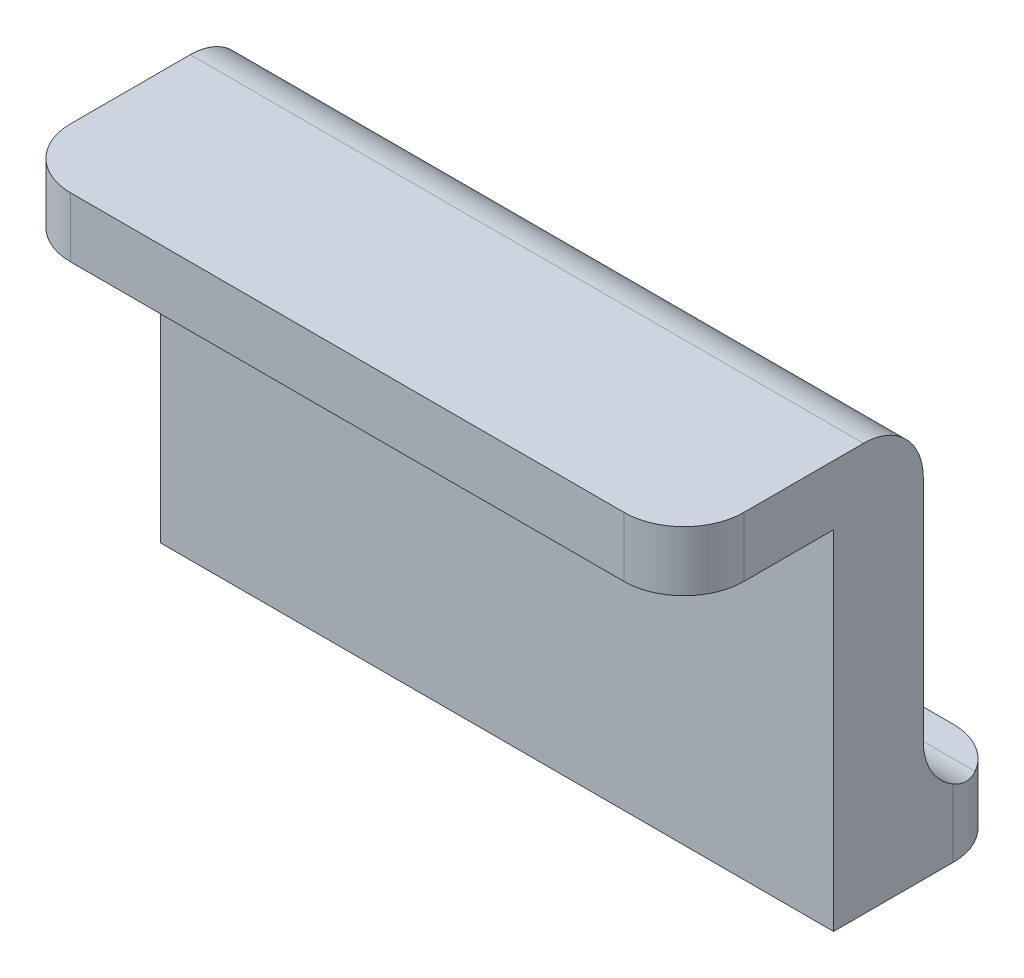
ISO-10303-21;
HEADER;
FILE_DESCRIPTION(('STEP AP214'),'2;1');
FILE_NAME('part.step','',(''),(''),'','','');
FILE_SCHEMA(('AUTOMOTIVE_DESIGN { 1 0 10303 214 1 1 1 1 }'));
ENDSEC;
DATA;
#1=APPLICATION_CONTEXT('core data for automotive mechanical design processes');
#2=APPLICATION_PROTOCOL_DEFINITION('international standard','automotive_design',2000,#1);
#3=PRODUCT_CONTEXT('',#1,'mechanical');
#4=PRODUCT('Part','Part','',(#3));
#5=PRODUCT_RELATED_PRODUCT_CATEGORY('part','',(#4));
#6=PRODUCT_DEFINITION_FORMATION('','',#4);
#7=PRODUCT_DEFINITION_CONTEXT('part definition',#1,'design');
#8=PRODUCT_DEFINITION('design','',#6,#7);
#9=PRODUCT_DEFINITION_SHAPE('','',#8);
#10=(LENGTH_UNIT() NAMED_UNIT(*) SI_UNIT(.MILLI.,.METRE.));
#11=(NAMED_UNIT(*) PLANE_ANGLE_UNIT() SI_UNIT($,.RADIAN.));
#12=(NAMED_UNIT(*) SI_UNIT($,.STERADIAN.) SOLID_ANGLE_UNIT());
#13=UNCERTAINTY_MEASURE_WITH_UNIT(LENGTH_MEASURE(1.E-05),#10,'distance_accuracy_value','');
#14=(GEOMETRIC_REPRESENTATION_CONTEXT(3) GLOBAL_UNCERTAINTY_ASSIGNED_CONTEXT((#13)) GLOBAL_UNIT_ASSIGNED_CONTEXT((#10,
#11,#12)) REPRESENTATION_CONTEXT('',''));
#15=CARTESIAN_POINT('',(0.,0.,0.));
#16=DIRECTION('',(0.,0.,1.));
#17=DIRECTION('',(1.,0.,0.));
#18=AXIS2_PLACEMENT_3D('',#15,#16,#17);
#19=CARTESIAN_POINT('',(20.5000000000001,-9.62999999999984,-5.00000000000003));
#20=DIRECTION('',(0.,-1.,0.));
#21=DIRECTION('',(1.,0.,0.));
#22=AXIS2_PLACEMENT_3D('',#19,#20,#21);
#23=PLANE('',#22);
#24=CARTESIAN_POINT('',(1.99999999999999,-9.62999999999997,-9.00000000000001));
#25=DIRECTION('',(0.,-1.,0.));
#26=DIRECTION('',(1.,0.,0.));
#27=AXIS2_PLACEMENT_3D('',#24,#25,#26);
#28=CIRCLE('',#27,2.);
#29=CARTESIAN_POINT('',(0.267949192431116,-9.62999999999998,-10.));
#30=VERTEX_POINT('',#29);
#31=CARTESIAN_POINT('',(1.99999999999999,-9.62999999999996,-11.));
#32=VERTEX_POINT('',#31);
#33=EDGE_CURVE('E171',#30,#32,#28,.T.);
#34=ORIENTED_EDGE('',*,*,#33,.F.);
#35=DIRECTION('',(-1.,0.,0.));
#36=VECTOR('',#35,1.);
#37=CARTESIAN_POINT('',(22.5,-9.62999999999982,-10.));
#38=LINE('',#37,#36);
#39=CARTESIAN_POINT('',(22.2320508075689,-9.62999999999982,-10.));
#40=VERTEX_POINT('',#39);
#41=EDGE_CURVE('E228',#30,#40,#38,.F.);
#42=ORIENTED_EDGE('',*,*,#41,.T.);
#43=CARTESIAN_POINT('',(20.5,-9.62999999999984,-9.00000000000001));
#44=DIRECTION('',(0.,-1.,0.));
#45=DIRECTION('',(1.,0.,0.));
#46=AXIS2_PLACEMENT_3D('',#43,#44,#45);
#47=CIRCLE('',#46,2.);
#48=CARTESIAN_POINT('',(20.5,-9.62999999999983,-11.));
#49=VERTEX_POINT('',#48);
#50=EDGE_CURVE('E177',#49,#40,#47,.T.);
#51=ORIENTED_EDGE('',*,*,#50,.F.);
#52=DIRECTION('',(1.,0.,0.));
#53=VECTOR('',#52,1.);
#54=CARTESIAN_POINT('',(1.99999999999999,-9.62999999999996,-11.));
#55=LINE('',#54,#53);
#56=EDGE_CURVE('E173',#32,#49,#55,.T.);
#57=ORIENTED_EDGE('',*,*,#56,.F.);
#58=EDGE_LOOP('',(#34,#42,#51,#57));
#59=FACE_BOUND('',#58,.T.);
#60=ADVANCED_FACE('F33',(#59),#23,.F.);
#61=CARTESIAN_POINT('',(2.,-11.63,-5.));
#62=DIRECTION('',(0.,1.,0.));
#63=DIRECTION('',(0.,0.,1.));
#64=AXIS2_PLACEMENT_3D('',#61,#62,#63);
#65=PLANE('',#64);
#66=DIRECTION('',(-1.,0.,0.));
#67=VECTOR('',#66,1.);
#68=CARTESIAN_POINT('',(22.5000000000003,-11.63,-5.00000000000003));
#69=LINE('',#68,#67);
#70=CARTESIAN_POINT('',(22.5000000000003,-11.63,-5.00000000000003));
#71=VERTEX_POINT('',#70);
#72=CARTESIAN_POINT('',(0.,-11.63,-5.00000000000003));
#73=VERTEX_POINT('',#72);
#74=EDGE_CURVE('E148',#71,#73,#69,.T.);
#75=ORIENTED_EDGE('',*,*,#74,.T.);
#76=DIRECTION('',(0.,0.,1.));
#77=VECTOR('',#76,1.);
#78=CARTESIAN_POINT('',(0.,-11.63,-5.));
#79=LINE('',#78,#77);
#80=CARTESIAN_POINT('',(0.,-11.63,-9.00000000000002));
#81=VERTEX_POINT('',#80);
#82=EDGE_CURVE('E133',#81,#73,#79,.T.);
#83=ORIENTED_EDGE('',*,*,#82,.F.);
#84=CARTESIAN_POINT('',(2.,-11.63,-9.00000000000002));
#85=DIRECTION('',(0.,-1.,0.));
#86=DIRECTION('',(1.,0.,0.));
#87=AXIS2_PLACEMENT_3D('',#84,#85,#86);
#88=CIRCLE('',#87,2.);
#89=CARTESIAN_POINT('',(2.,-11.63,-11.));
#90=VERTEX_POINT('',#89);
#91=EDGE_CURVE('E170',#81,#90,#88,.T.);
#92=ORIENTED_EDGE('',*,*,#91,.T.);
#93=DIRECTION('',(1.,0.,0.));
#94=VECTOR('',#93,1.);
#95=CARTESIAN_POINT('',(2.,-11.63,-11.));
#96=LINE('',#95,#94);
#97=CARTESIAN_POINT('',(20.5000000000001,-11.6299999999998,-11.));
#98=VERTEX_POINT('',#97);
#99=EDGE_CURVE('E181',#90,#98,#96,.T.);
#100=ORIENTED_EDGE('',*,*,#99,.T.);
#101=CARTESIAN_POINT('',(20.5000000000001,-11.6299999999998,-9.00000000000002));
#102=DIRECTION('',(0.,-1.,0.));
#103=DIRECTION('',(1.,0.,0.));
#104=AXIS2_PLACEMENT_3D('',#101,#102,#103);
#105=CIRCLE('',#104,2.);
#106=CARTESIAN_POINT('',(22.5000000000001,-11.6299999999998,-9.00000000000002));
#107=VERTEX_POINT('',#106);
#108=EDGE_CURVE('E174',#98,#107,#105,.T.);
#109=ORIENTED_EDGE('',*,*,#108,.T.);
#110=DIRECTION('',(0.,0.,-1.));
#111=VECTOR('',#110,1.);
#112=CARTESIAN_POINT('',(22.5,-11.63,-5.));
#113=LINE('',#112,#111);
#114=EDGE_CURVE('E143',#71,#107,#113,.T.);
#115=ORIENTED_EDGE('',*,*,#114,.F.);
#116=EDGE_LOOP('',(#75,#83,#92,#100,#109,#115));
#117=FACE_BOUND('',#116,.T.);
#118=ADVANCED_FACE('F154',(#117),#65,.F.);
#119=CARTESIAN_POINT('',(20.5,-9.62999999999984,-9.00000000000001));
#120=DIRECTION('',(0.,-1.,0.));
#121=DIRECTION('',(1.,0.,0.));
#122=AXIS2_PLACEMENT_3D('',#119,#120,#121);
#123=CYLINDRICAL_SURFACE('',#122,2.);
#124=ORIENTED_EDGE('',*,*,#108,.F.);
#125=DIRECTION('',(0.,-1.,0.));
#126=VECTOR('',#125,1.);
#127=CARTESIAN_POINT('',(20.5,-9.62999999999983,-11.));
#128=LINE('',#127,#126);
#129=EDGE_CURVE('E186',#49,#98,#128,.T.);
#130=ORIENTED_EDGE('',*,*,#129,.F.);
#131=ORIENTED_EDGE('',*,*,#50,.T.);
#132=CARTESIAN_POINT('',(22.2320508075689,-9.62999999999982,-10.));
#133=CARTESIAN_POINT('',(22.2532543585525,-9.63000582336066,-9.96328949807708));
#134=CARTESIAN_POINT('',(22.2732816954026,-9.62898920413644,-9.92589035620287));
#135=CARTESIAN_POINT('',(22.310886635328,-9.62472694242895,-9.84998615163987));
#136=CARTESIAN_POINT('',(22.3284632545006,-9.62148040777174,-9.81148065221543));
#137=CARTESIAN_POINT('',(22.3610482817277,-9.61257497903467,-9.73367455806133));
#138=CARTESIAN_POINT('',(22.376057323387,-9.60691668131581,-9.69437416217401));
#139=CARTESIAN_POINT('',(22.4034509332815,-9.59306905722044,-9.6153270771921));
#140=CARTESIAN_POINT('',(22.4158360642531,-9.58488027447186,-9.57558048572007));
#141=CARTESIAN_POINT('',(22.4490813852997,-9.55632820920577,-9.45597583000072));
#142=CARTESIAN_POINT('',(22.4659723496888,-9.53199453282509,-9.37589597407771));
#143=CARTESIAN_POINT('',(22.4896359876529,-9.4728601982396,-9.21837892489139));
#144=CARTESIAN_POINT('',(22.496432780998,-9.43808473047974,-9.14093586553849));
#145=CARTESIAN_POINT('',(22.4992772698719,-9.3926609376351,-9.05491456474152));
#146=CARTESIAN_POINT('',(22.499549809393,-9.38668163750179,-9.04384685892208));
#147=CARTESIAN_POINT('',(22.4999109060144,-9.37451956100022,-9.02183409565792));
#148=CARTESIAN_POINT('',(22.4999996327205,-9.36833697756048,-9.01088893442525));
#149=CARTESIAN_POINT('',(22.5,-9.36205080756869,-9.00000000000001));
#150=B_SPLINE_CURVE_WITH_KNOTS('',3,(#132,#133,#134,#135,#136,#137,#138,#139,#140,#141,#142,
#143,#144,#145,#146,#147,#148,#149),.UNSPECIFIED.,.F.,.F.,(4,2,2,2,2,2,2,2,4),(0.,
0.127159561382101,0.25437002809369,0.381549057475173,0.508700783765295,0.763464547972432,
1.01761857554666,1.05536583812813,1.09307825540804),.UNSPECIFIED.);
#151=CARTESIAN_POINT('',(22.5,-9.36205080756869,-9.00000000000001));
#152=VERTEX_POINT('',#151);
#153=EDGE_CURVE('E41',#40,#152,#150,.T.);
#154=ORIENTED_EDGE('',*,*,#153,.T.);
#155=DIRECTION('',(0.,-1.,0.));
#156=VECTOR('',#155,1.);
#157=CARTESIAN_POINT('',(22.5,-9.62999999999982,-9.00000000000001));
#158=LINE('',#157,#156);
#159=EDGE_CURVE('E47',#152,#107,#158,.T.);
#160=ORIENTED_EDGE('',*,*,#159,.T.);
#161=EDGE_LOOP('',(#124,#130,#131,#154,#160));
#162=FACE_BOUND('',#161,.T.);
#163=ADVANCED_FACE('F261',(#162),#123,.T.);
#164=CARTESIAN_POINT('',(1.99999999999999,-9.62999999999996,-11.));
#165=DIRECTION('',(0.,0.,-1.));
#166=DIRECTION('',(0.,1.,0.));
#167=AXIS2_PLACEMENT_3D('',#164,#165,#166);
#168=PLANE('',#167);
#169=ORIENTED_EDGE('',*,*,#99,.F.);
#170=DIRECTION('',(0.,-1.,0.));
#171=VECTOR('',#170,1.);
#172=CARTESIAN_POINT('',(1.99999999999999,-9.62999999999996,-11.));
#173=LINE('',#172,#171);
#174=EDGE_CURVE('E188',#32,#90,#173,.T.);
#175=ORIENTED_EDGE('',*,*,#174,.F.);
#176=ORIENTED_EDGE('',*,*,#56,.T.);
#177=ORIENTED_EDGE('',*,*,#129,.T.);
#178=EDGE_LOOP('',(#169,#175,#176,#177));
#179=FACE_BOUND('',#178,.T.);
#180=ADVANCED_FACE('F258',(#179),#168,.T.);
#181=CARTESIAN_POINT('',(1.99999999999999,-9.62999999999997,-9.00000000000001));
#182=DIRECTION('',(0.,-1.,0.));
#183=DIRECTION('',(1.,0.,0.));
#184=AXIS2_PLACEMENT_3D('',#181,#182,#183);
#185=CYLINDRICAL_SURFACE('',#184,2.);
#186=ORIENTED_EDGE('',*,*,#91,.F.);
#187=DIRECTION('',(0.,-1.,0.));
#188=VECTOR('',#187,1.);
#189=CARTESIAN_POINT('',(0.,-9.62999999999998,-9.00000000000001));
#190=LINE('',#189,#188);
#191=CARTESIAN_POINT('',(0.,-9.36205080756885,-9.00000000000001));
#192=VERTEX_POINT('',#191);
#193=EDGE_CURVE('E55',#192,#81,#190,.T.);
#194=ORIENTED_EDGE('',*,*,#193,.F.);
#195=CARTESIAN_POINT('',(0.,-9.36205080756885,-9.00000000000001));
#196=CARTESIAN_POINT('',(-5.82336084557029E-06,-9.38325435855244,-9.03671050192296));
#197=CARTESIAN_POINT('',(0.00101079586336832,-9.40328169540257,-9.07410964379718));
#198=CARTESIAN_POINT('',(0.00527305757086106,-9.44088663532798,-9.15001384836017));
#199=CARTESIAN_POINT('',(0.00851959222807289,-9.45846325450054,-9.18851934778461));
#200=CARTESIAN_POINT('',(0.0174250209651449,-9.49104828172769,-9.26632544193871));
#201=CARTESIAN_POINT('',(0.0230833186839982,-9.50605732338695,-9.30562583782603));
#202=CARTESIAN_POINT('',(0.0369309427793674,-9.53345093328145,-9.38467292280795));
#203=CARTESIAN_POINT('',(0.0451197255279513,-9.54583606425304,-9.42441951427997));
#204=CARTESIAN_POINT('',(0.0736717907940388,-9.5790813852996,-9.54402416999932));
#205=CARTESIAN_POINT('',(0.098005467174716,-9.59597234968877,-9.62410402592234));
#206=CARTESIAN_POINT('',(0.15713980176021,-9.61963598765283,-9.78162107510865));
#207=CARTESIAN_POINT('',(0.19191526952007,-9.62643278099795,-9.85906413446155));
#208=CARTESIAN_POINT('',(0.237339062364713,-9.6292772698718,-9.94508543525852));
#209=CARTESIAN_POINT('',(0.243318362498015,-9.62954980939291,-9.95615314107796));
#210=CARTESIAN_POINT('',(0.255480438999585,-9.62991090601429,-9.97816590434212));
#211=CARTESIAN_POINT('',(0.261663022439332,-9.62999963272039,-9.98911106557479));
#212=CARTESIAN_POINT('',(0.267949192431115,-9.62999999999998,-10.));
#213=B_SPLINE_CURVE_WITH_KNOTS('',3,(#195,#196,#197,#198,#199,#200,#201,#202,#203,#204,#205,
#206,#207,#208,#209,#210,#211,#212),.UNSPECIFIED.,.F.,.F.,(4,2,2,2,2,2,2,2,4),(0.,
0.127159561382106,0.254370028093691,0.381549057475175,0.508700783765294,0.76346454797243,
1.01761857554666,1.05536583812813,1.09307825540803),.UNSPECIFIED.);
#214=EDGE_CURVE('E238',#192,#30,#213,.T.);
#215=ORIENTED_EDGE('',*,*,#214,.T.);
#216=ORIENTED_EDGE('',*,*,#33,.T.);
#217=ORIENTED_EDGE('',*,*,#174,.T.);
#218=EDGE_LOOP('',(#186,#194,#215,#216,#217));
#219=FACE_BOUND('',#218,.T.);
#220=ADVANCED_FACE('F252',(#219),#185,.T.);
#221=CARTESIAN_POINT('',(22.4999999999998,24.6991189256325,-7.99999999999995));
#222=DIRECTION('',(0.,0.,1.));
#223=DIRECTION('',(0.,-1.,0.));
#224=AXIS2_PLACEMENT_3D('',#221,#222,#223);
#225=PLANE('',#224);
#226=DIRECTION('',(0.,-1.,0.));
#227=VECTOR('',#226,1.);
#228=CARTESIAN_POINT('',(22.4999999999998,24.6991189256325,-7.99999999999995));
#229=LINE('',#228,#227);
#230=CARTESIAN_POINT('',(22.5,0.,-8.00000000000001));
#231=VERTEX_POINT('',#230);
#232=CARTESIAN_POINT('',(22.5000000000001,-7.62999999999982,-8.00000000000002));
#233=VERTEX_POINT('',#232);
#234=EDGE_CURVE('E162',#231,#233,#229,.T.);
#235=ORIENTED_EDGE('',*,*,#234,.T.);
#236=DIRECTION('',(-1.,0.,0.));
#237=VECTOR('',#236,1.);
#238=CARTESIAN_POINT('',(0.,-7.62999999999998,-8.00000000000002));
#239=LINE('',#238,#237);
#240=CARTESIAN_POINT('',(0.,-7.62999999999998,-8.00000000000002));
#241=VERTEX_POINT('',#240);
#242=EDGE_CURVE('E225',#233,#241,#239,.T.);
#243=ORIENTED_EDGE('',*,*,#242,.T.);
#244=DIRECTION('',(0.,-1.,0.));
#245=VECTOR('',#244,1.);
#246=CARTESIAN_POINT('',(-2.3881072034491E-13,24.6991189256323,-7.99999999999994));
#247=LINE('',#246,#245);
#248=CARTESIAN_POINT('',(0.,0.,-8.));
#249=VERTEX_POINT('',#248);
#250=EDGE_CURVE('E151',#249,#241,#247,.T.);
#251=ORIENTED_EDGE('',*,*,#250,.F.);
#252=DIRECTION('',(1.,0.,0.));
#253=VECTOR('',#252,1.);
#254=CARTESIAN_POINT('',(22.4999999999998,0.,-8.00000000000001));
#255=LINE('',#254,#253);
#256=EDGE_CURVE('E222',#249,#231,#255,.T.);
#257=ORIENTED_EDGE('',*,*,#256,.T.);
#258=EDGE_LOOP('',(#235,#243,#251,#257));
#259=FACE_BOUND('',#258,.T.);
#260=ADVANCED_FACE('F257',(#259),#225,.F.);
#261=CARTESIAN_POINT('',(22.4999999999998,24.6991189256325,-4.99999999999995));
#262=DIRECTION('',(0.,0.,-1.));
#263=DIRECTION('',(0.,1.,0.));
#264=AXIS2_PLACEMENT_3D('',#261,#262,#263);
#265=PLANE('',#264);
#266=DIRECTION('',(1.,0.,0.));
#267=VECTOR('',#266,1.);
#268=CARTESIAN_POINT('',(20.5,0.,-5.));
#269=LINE('',#268,#267);
#270=CARTESIAN_POINT('',(0.,0.,-5.));
#271=VERTEX_POINT('',#270);
#272=CARTESIAN_POINT('',(22.5,0.,-5.));
#273=VERTEX_POINT('',#272);
#274=EDGE_CURVE('E150',#271,#273,#269,.T.);
#275=ORIENTED_EDGE('',*,*,#274,.F.);
#276=DIRECTION('',(0.,-1.,0.));
#277=VECTOR('',#276,1.);
#278=CARTESIAN_POINT('',(-2.48073483034549E-13,24.6991189256323,-4.99999999999995));
#279=LINE('',#278,#277);
#280=EDGE_CURVE('E138',#271,#73,#279,.T.);
#281=ORIENTED_EDGE('',*,*,#280,.T.);
#282=ORIENTED_EDGE('',*,*,#74,.F.);
#283=DIRECTION('',(0.,-1.,0.));
#284=VECTOR('',#283,1.);
#285=CARTESIAN_POINT('',(22.4999999999998,24.6991189256325,-4.99999999999995));
#286=LINE('',#285,#284);
#287=EDGE_CURVE('E152',#273,#71,#286,.T.);
#288=ORIENTED_EDGE('',*,*,#287,.F.);
#289=EDGE_LOOP('',(#275,#281,#282,#288));
#290=FACE_BOUND('',#289,.T.);
#291=ADVANCED_FACE('F147',(#290),#265,.F.);
#292=CARTESIAN_POINT('',(2.,2.,-2.));
#293=DIRECTION('',(0.,-1.,0.));
#294=DIRECTION('',(0.,0.,-1.));
#295=AXIS2_PLACEMENT_3D('',#292,#293,#294);
#296=CYLINDRICAL_SURFACE('',#295,2.);
#297=DIRECTION('',(0.,-1.,0.));
#298=VECTOR('',#297,1.);
#299=CARTESIAN_POINT('',(0.,2.,-2.));
#300=LINE('',#299,#298);
#301=CARTESIAN_POINT('',(0.,2.,-2.));
#302=VERTEX_POINT('',#301);
#303=CARTESIAN_POINT('',(0.,0.,-2.));
#304=VERTEX_POINT('',#303);
#305=EDGE_CURVE('E218',#302,#304,#300,.T.);
#306=ORIENTED_EDGE('',*,*,#305,.T.);
#307=CARTESIAN_POINT('',(2.,0.,-2.));
#308=DIRECTION('',(0.,1.,0.));
#309=DIRECTION('',(0.,0.,-1.));
#310=AXIS2_PLACEMENT_3D('',#307,#308,#309);
#311=CIRCLE('',#310,2.);
#312=CARTESIAN_POINT('',(2.,0.,0.));
#313=VERTEX_POINT('',#312);
#314=EDGE_CURVE('E192',#304,#313,#311,.T.);
#315=ORIENTED_EDGE('',*,*,#314,.T.);
#316=DIRECTION('',(0.,-1.,0.));
#317=VECTOR('',#316,1.);
#318=CARTESIAN_POINT('',(2.,2.,0.));
#319=LINE('',#318,#317);
#320=CARTESIAN_POINT('',(2.,2.,0.));
#321=VERTEX_POINT('',#320);
#322=EDGE_CURVE('E215',#321,#313,#319,.T.);
#323=ORIENTED_EDGE('',*,*,#322,.F.);
#324=CARTESIAN_POINT('',(2.,2.,-2.));
#325=DIRECTION('',(0.,1.,0.));
#326=DIRECTION('',(0.,0.,-1.));
#327=AXIS2_PLACEMENT_3D('',#324,#325,#326);
#328=CIRCLE('',#327,2.);
#329=EDGE_CURVE('E195',#302,#321,#328,.T.);
#330=ORIENTED_EDGE('',*,*,#329,.F.);
#331=EDGE_LOOP('',(#306,#315,#323,#330));
#332=FACE_BOUND('',#331,.T.);
#333=ADVANCED_FACE('F280',(#332),#296,.T.);
#334=CARTESIAN_POINT('',(2.,2.,0.));
#335=DIRECTION('',(0.,0.,-1.));
#336=DIRECTION('',(-1.,0.,0.));
#337=AXIS2_PLACEMENT_3D('',#334,#335,#336);
#338=PLANE('',#337);
#339=DIRECTION('',(1.,0.,0.));
#340=VECTOR('',#339,1.);
#341=CARTESIAN_POINT('',(2.,0.,0.));
#342=LINE('',#341,#340);
#343=CARTESIAN_POINT('',(20.5,0.,0.));
#344=VERTEX_POINT('',#343);
#345=EDGE_CURVE('E207',#313,#344,#342,.T.);
#346=ORIENTED_EDGE('',*,*,#345,.T.);
#347=DIRECTION('',(0.,-1.,0.));
#348=VECTOR('',#347,1.);
#349=CARTESIAN_POINT('',(20.5,2.,0.));
#350=LINE('',#349,#348);
#351=CARTESIAN_POINT('',(20.5,2.,0.));
#352=VERTEX_POINT('',#351);
#353=EDGE_CURVE('E212',#352,#344,#350,.T.);
#354=ORIENTED_EDGE('',*,*,#353,.F.);
#355=DIRECTION('',(1.,0.,0.));
#356=VECTOR('',#355,1.);
#357=CARTESIAN_POINT('',(2.,2.,0.));
#358=LINE('',#357,#356);
#359=EDGE_CURVE('E198',#321,#352,#358,.T.);
#360=ORIENTED_EDGE('',*,*,#359,.F.);
#361=ORIENTED_EDGE('',*,*,#322,.T.);
#362=EDGE_LOOP('',(#346,#354,#360,#361));
#363=FACE_BOUND('',#362,.T.);
#364=ADVANCED_FACE('F276',(#363),#338,.F.);
#365=CARTESIAN_POINT('',(20.5,2.,-2.));
#366=DIRECTION('',(0.,-1.,0.));
#367=DIRECTION('',(0.,0.,-1.));
#368=AXIS2_PLACEMENT_3D('',#365,#366,#367);
#369=CYLINDRICAL_SURFACE('',#368,2.);
#370=CARTESIAN_POINT('',(20.5,0.,-2.));
#371=DIRECTION('',(0.,1.,0.));
#372=DIRECTION('',(0.,0.,1.));
#373=AXIS2_PLACEMENT_3D('',#370,#371,#372);
#374=CIRCLE('',#373,2.);
#375=CARTESIAN_POINT('',(22.5,0.,-2.));
#376=VERTEX_POINT('',#375);
#377=EDGE_CURVE('E196',#344,#376,#374,.T.);
#378=ORIENTED_EDGE('',*,*,#377,.T.);
#379=DIRECTION('',(0.,-1.,0.));
#380=VECTOR('',#379,1.);
#381=CARTESIAN_POINT('',(22.5,2.,-2.));
#382=LINE('',#381,#380);
#383=CARTESIAN_POINT('',(22.5,2.,-2.));
#384=VERTEX_POINT('',#383);
#385=EDGE_CURVE('E205',#384,#376,#382,.T.);
#386=ORIENTED_EDGE('',*,*,#385,.F.);
#387=CARTESIAN_POINT('',(20.5,2.,-2.));
#388=DIRECTION('',(0.,1.,0.));
#389=DIRECTION('',(0.,0.,1.));
#390=AXIS2_PLACEMENT_3D('',#387,#388,#389);
#391=CIRCLE('',#390,2.);
#392=EDGE_CURVE('E200',#352,#384,#391,.T.);
#393=ORIENTED_EDGE('',*,*,#392,.F.);
#394=ORIENTED_EDGE('',*,*,#353,.T.);
#395=EDGE_LOOP('',(#378,#386,#393,#394));
#396=FACE_BOUND('',#395,.T.);
#397=ADVANCED_FACE('F270',(#396),#369,.T.);
#398=CARTESIAN_POINT('',(20.5,0.,-5.));
#399=DIRECTION('',(0.,-1.,0.));
#400=DIRECTION('',(0.,0.,-1.));
#401=AXIS2_PLACEMENT_3D('',#398,#399,#400);
#402=PLANE('',#401);
#403=DIRECTION('',(0.,0.,-1.));
#404=VECTOR('',#403,1.);
#405=CARTESIAN_POINT('',(0.,0.,0.));
#406=LINE('',#405,#404);
#407=EDGE_CURVE('E165',#304,#271,#406,.T.);
#408=ORIENTED_EDGE('',*,*,#407,.T.);
#409=ORIENTED_EDGE('',*,*,#274,.T.);
#410=DIRECTION('',(0.,0.,1.));
#411=VECTOR('',#410,1.);
#412=CARTESIAN_POINT('',(22.5,0.,0.));
#413=LINE('',#412,#411);
#414=EDGE_CURVE('E167',#273,#376,#413,.T.);
#415=ORIENTED_EDGE('',*,*,#414,.T.);
#416=ORIENTED_EDGE('',*,*,#377,.F.);
#417=ORIENTED_EDGE('',*,*,#345,.F.);
#418=ORIENTED_EDGE('',*,*,#314,.F.);
#419=EDGE_LOOP('',(#408,#409,#415,#416,#417,#418));
#420=FACE_BOUND('',#419,.T.);
#421=ADVANCED_FACE('F266',(#420),#402,.T.);
#422=CARTESIAN_POINT('',(22.5,2.,-2.));
#423=DIRECTION('',(-1.,0.,0.));
#424=DIRECTION('',(0.,0.,1.));
#425=AXIS2_PLACEMENT_3D('',#422,#423,#424);
#426=PLANE('',#425);
#427=ORIENTED_EDGE('',*,*,#234,.F.);
#428=CARTESIAN_POINT('',(22.5,0.,-6.00000000000001));
#429=DIRECTION('',(-1.,0.,0.));
#430=DIRECTION('',(0.,0.,1.));
#431=AXIS2_PLACEMENT_3D('',#428,#429,#430);
#432=CIRCLE('',#431,2.);
#433=CARTESIAN_POINT('',(22.5,2.,-6.00000000000001));
#434=VERTEX_POINT('',#433);
#435=EDGE_CURVE('E230',#231,#434,#432,.F.);
#436=ORIENTED_EDGE('',*,*,#435,.T.);
#437=DIRECTION('',(0.,0.,-1.));
#438=VECTOR('',#437,1.);
#439=CARTESIAN_POINT('',(22.5,2.,-2.));
#440=LINE('',#439,#438);
#441=EDGE_CURVE('E202',#384,#434,#440,.T.);
#442=ORIENTED_EDGE('',*,*,#441,.F.);
#443=ORIENTED_EDGE('',*,*,#385,.T.);
#444=ORIENTED_EDGE('',*,*,#414,.F.);
#445=ORIENTED_EDGE('',*,*,#287,.T.);
#446=ORIENTED_EDGE('',*,*,#114,.T.);
#447=ORIENTED_EDGE('',*,*,#159,.F.);
#448=CARTESIAN_POINT('',(22.5,-7.62999999999982,-10.));
#449=DIRECTION('',(-1.,0.,0.));
#450=DIRECTION('',(0.,0.,1.));
#451=AXIS2_PLACEMENT_3D('',#448,#449,#450);
#452=CIRCLE('',#451,2.);
#453=EDGE_CURVE('E11',#152,#233,#452,.T.);
#454=ORIENTED_EDGE('',*,*,#453,.T.);
#455=EDGE_LOOP('',(#427,#436,#442,#443,#444,#445,#446,#447,#454));
#456=FACE_BOUND('',#455,.T.);
#457=ADVANCED_FACE('F269',(#456),#426,.F.);
#458=CARTESIAN_POINT('',(0.,2.,-2.));
#459=DIRECTION('',(1.,0.,0.));
#460=DIRECTION('',(0.,0.,-1.));
#461=AXIS2_PLACEMENT_3D('',#458,#459,#460);
#462=PLANE('',#461);
#463=DIRECTION('',(0.,0.,1.));
#464=VECTOR('',#463,1.);
#465=CARTESIAN_POINT('',(0.,2.,-2.));
#466=LINE('',#465,#464);
#467=CARTESIAN_POINT('',(0.,2.,-6.));
#468=VERTEX_POINT('',#467);
#469=EDGE_CURVE('E193',#468,#302,#466,.T.);
#470=ORIENTED_EDGE('',*,*,#469,.F.);
#471=CARTESIAN_POINT('',(0.,0.,-6.));
#472=DIRECTION('',(1.,0.,0.));
#473=DIRECTION('',(0.,0.,-1.));
#474=AXIS2_PLACEMENT_3D('',#471,#472,#473);
#475=CIRCLE('',#474,2.);
#476=EDGE_CURVE('E234',#468,#249,#475,.F.);
#477=ORIENTED_EDGE('',*,*,#476,.T.);
#478=ORIENTED_EDGE('',*,*,#250,.T.);
#479=CARTESIAN_POINT('',(0.,-7.62999999999998,-10.));
#480=DIRECTION('',(1.,0.,0.));
#481=DIRECTION('',(0.,0.,-1.));
#482=AXIS2_PLACEMENT_3D('',#479,#480,#481);
#483=CIRCLE('',#482,2.);
#484=EDGE_CURVE('E236',#241,#192,#483,.T.);
#485=ORIENTED_EDGE('',*,*,#484,.T.);
#486=ORIENTED_EDGE('',*,*,#193,.T.);
#487=ORIENTED_EDGE('',*,*,#82,.T.);
#488=ORIENTED_EDGE('',*,*,#280,.F.);
#489=ORIENTED_EDGE('',*,*,#407,.F.);
#490=ORIENTED_EDGE('',*,*,#305,.F.);
#491=EDGE_LOOP('',(#470,#477,#478,#485,#486,#487,#488,#489,#490));
#492=FACE_BOUND('',#491,.T.);
#493=ADVANCED_FACE('F136',(#492),#462,.F.);
#494=CARTESIAN_POINT('',(20.5,2.,-5.));
#495=DIRECTION('',(0.,-1.,0.));
#496=DIRECTION('',(0.,0.,-1.));
#497=AXIS2_PLACEMENT_3D('',#494,#495,#496);
#498=PLANE('',#497);
#499=ORIENTED_EDGE('',*,*,#441,.T.);
#500=DIRECTION('',(1.,0.,0.));
#501=VECTOR('',#500,1.);
#502=CARTESIAN_POINT('',(20.5,2.,-6.00000000000001));
#503=LINE('',#502,#501);
#504=EDGE_CURVE('E232',#434,#468,#503,.F.);
#505=ORIENTED_EDGE('',*,*,#504,.T.);
#506=ORIENTED_EDGE('',*,*,#469,.T.);
#507=ORIENTED_EDGE('',*,*,#329,.T.);
#508=ORIENTED_EDGE('',*,*,#359,.T.);
#509=ORIENTED_EDGE('',*,*,#392,.T.);
#510=EDGE_LOOP('',(#499,#505,#506,#507,#508,#509));
#511=FACE_BOUND('',#510,.T.);
#512=ADVANCED_FACE('F262',(#511),#498,.F.);
#513=CARTESIAN_POINT('',(22.5000000000001,-7.62999999999982,-10.));
#514=DIRECTION('',(1.,0.,0.));
#515=DIRECTION('',(0.,1.,0.));
#516=AXIS2_PLACEMENT_3D('',#513,#514,#515);
#517=CYLINDRICAL_SURFACE('',#516,2.);
#518=ORIENTED_EDGE('',*,*,#153,.F.);
#519=ORIENTED_EDGE('',*,*,#41,.F.);
#520=ORIENTED_EDGE('',*,*,#214,.F.);
#521=ORIENTED_EDGE('',*,*,#484,.F.);
#522=ORIENTED_EDGE('',*,*,#242,.F.);
#523=ORIENTED_EDGE('',*,*,#453,.F.);
#524=EDGE_LOOP('',(#518,#519,#520,#521,#522,#523));
#525=FACE_BOUND('',#524,.T.);
#526=ADVANCED_FACE('F249',(#525),#517,.F.);
#527=CARTESIAN_POINT('',(22.4999999999998,0.,-6.00000000000001));
#528=DIRECTION('',(1.,0.,0.));
#529=DIRECTION('',(0.,0.,-1.));
#530=AXIS2_PLACEMENT_3D('',#527,#528,#529);
#531=CYLINDRICAL_SURFACE('',#530,2.);
#532=ORIENTED_EDGE('',*,*,#476,.F.);
#533=ORIENTED_EDGE('',*,*,#504,.F.);
#534=ORIENTED_EDGE('',*,*,#435,.F.);
#535=ORIENTED_EDGE('',*,*,#256,.F.);
#536=EDGE_LOOP('',(#532,#533,#534,#535));
#537=FACE_BOUND('',#536,.T.);
#538=ADVANCED_FACE('F35',(#537),#531,.T.);
#539=CLOSED_SHELL('',(#60,#118,#163,#180,#220,#260,#291,#333,#364,#397,#421,#457,#493,#512,#526,#538));
#540=MANIFOLD_SOLID_BREP('B2',#539);
#541=ADVANCED_BREP_SHAPE_REPRESENTATION('',(#18,#540),#14);
#542=SHAPE_DEFINITION_REPRESENTATION(#9,#541);
ENDSEC;
END-ISO-10303-21;
